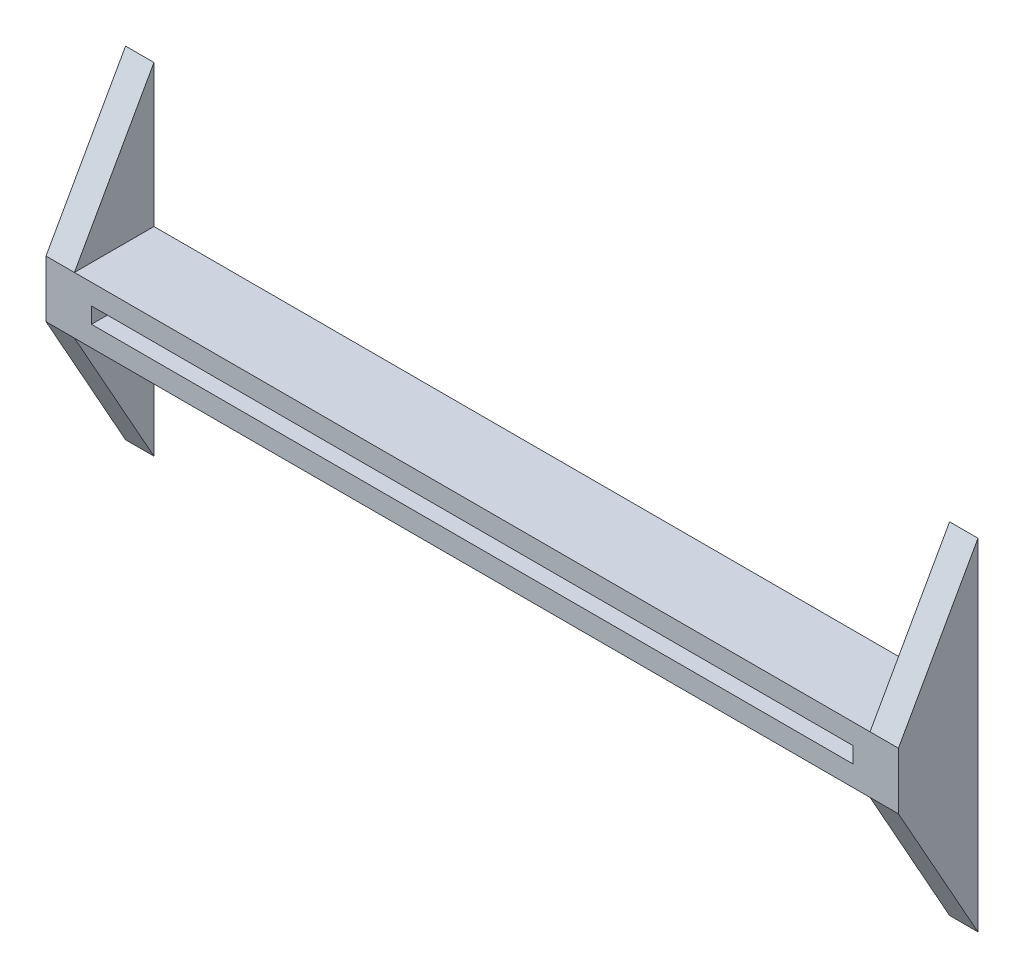
ISO-10303-21;
HEADER;
FILE_DESCRIPTION(('STEP AP214'),'2;1');
FILE_NAME('part.step','',(''),(''),'','','');
FILE_SCHEMA(('AUTOMOTIVE_DESIGN { 1 0 10303 214 1 1 1 1 }'));
ENDSEC;
DATA;
#1=APPLICATION_CONTEXT('core data for automotive mechanical design processes');
#2=APPLICATION_PROTOCOL_DEFINITION('international standard','automotive_design',2000,#1);
#3=PRODUCT_CONTEXT('',#1,'mechanical');
#4=PRODUCT('Part','Part','',(#3));
#5=PRODUCT_RELATED_PRODUCT_CATEGORY('part','',(#4));
#6=PRODUCT_DEFINITION_FORMATION('','',#4);
#7=PRODUCT_DEFINITION_CONTEXT('part definition',#1,'design');
#8=PRODUCT_DEFINITION('design','',#6,#7);
#9=PRODUCT_DEFINITION_SHAPE('','',#8);
#10=(LENGTH_UNIT() NAMED_UNIT(*) SI_UNIT(.MILLI.,.METRE.));
#11=(NAMED_UNIT(*) PLANE_ANGLE_UNIT() SI_UNIT($,.RADIAN.));
#12=(NAMED_UNIT(*) SI_UNIT($,.STERADIAN.) SOLID_ANGLE_UNIT());
#13=UNCERTAINTY_MEASURE_WITH_UNIT(LENGTH_MEASURE(1.E-05),#10,'distance_accuracy_value','');
#14=(GEOMETRIC_REPRESENTATION_CONTEXT(3) GLOBAL_UNCERTAINTY_ASSIGNED_CONTEXT((#13)) GLOBAL_UNIT_ASSIGNED_CONTEXT((#10,
#11,#12)) REPRESENTATION_CONTEXT('',''));
#15=CARTESIAN_POINT('',(0.,0.,0.));
#16=DIRECTION('',(0.,0.,1.));
#17=DIRECTION('',(1.,0.,0.));
#18=AXIS2_PLACEMENT_3D('',#15,#16,#17);
#19=CARTESIAN_POINT('',(0.,0.,5.));
#20=DIRECTION('',(0.,0.,-1.));
#21=DIRECTION('',(-1.,0.,0.));
#22=AXIS2_PLACEMENT_3D('',#19,#20,#21);
#23=PLANE('',#22);
#24=DIRECTION('',(-1.,0.,0.));
#25=VECTOR('',#24,1.);
#26=CARTESIAN_POINT('',(35.,2.5,5.));
#27=LINE('',#26,#25);
#28=CARTESIAN_POINT('',(35.,2.5,5.));
#29=VERTEX_POINT('',#28);
#30=CARTESIAN_POINT('',(-35.,2.5,5.));
#31=VERTEX_POINT('',#30);
#32=EDGE_CURVE('E170',#29,#31,#27,.T.);
#33=ORIENTED_EDGE('',*,*,#32,.T.);
#34=DIRECTION('',(1.,0.,0.));
#35=VECTOR('',#34,1.);
#36=CARTESIAN_POINT('',(-37.5,2.5,5.));
#37=LINE('',#36,#35);
#38=CARTESIAN_POINT('',(-37.5,2.5,5.));
#39=VERTEX_POINT('',#38);
#40=EDGE_CURVE('E147',#39,#31,#37,.T.);
#41=ORIENTED_EDGE('',*,*,#40,.F.);
#42=DIRECTION('',(0.,1.,0.));
#43=VECTOR('',#42,1.);
#44=CARTESIAN_POINT('',(-37.5,-2.5,5.));
#45=LINE('',#44,#43);
#46=CARTESIAN_POINT('',(-37.5,-2.5,5.));
#47=VERTEX_POINT('',#46);
#48=EDGE_CURVE('E155',#47,#39,#45,.T.);
#49=ORIENTED_EDGE('',*,*,#48,.F.);
#50=DIRECTION('',(1.,0.,0.));
#51=VECTOR('',#50,1.);
#52=CARTESIAN_POINT('',(-37.5,-2.5,5.));
#53=LINE('',#52,#51);
#54=CARTESIAN_POINT('',(-35.,-2.5,5.));
#55=VERTEX_POINT('',#54);
#56=EDGE_CURVE('E296',#47,#55,#53,.T.);
#57=ORIENTED_EDGE('',*,*,#56,.T.);
#58=DIRECTION('',(1.,0.,0.));
#59=VECTOR('',#58,1.);
#60=CARTESIAN_POINT('',(35.,-2.5,5.));
#61=LINE('',#60,#59);
#62=CARTESIAN_POINT('',(35.,-2.5,5.));
#63=VERTEX_POINT('',#62);
#64=EDGE_CURVE('E264',#55,#63,#61,.T.);
#65=ORIENTED_EDGE('',*,*,#64,.T.);
#66=DIRECTION('',(-1.,0.,0.));
#67=VECTOR('',#66,1.);
#68=CARTESIAN_POINT('',(37.5,-2.5,5.));
#69=LINE('',#68,#67);
#70=CARTESIAN_POINT('',(37.5,-2.5,5.));
#71=VERTEX_POINT('',#70);
#72=EDGE_CURVE('E215',#71,#63,#69,.T.);
#73=ORIENTED_EDGE('',*,*,#72,.F.);
#74=DIRECTION('',(0.,-1.,0.));
#75=VECTOR('',#74,1.);
#76=CARTESIAN_POINT('',(37.5,-2.5,5.));
#77=LINE('',#76,#75);
#78=CARTESIAN_POINT('',(37.5,2.5,5.));
#79=VERTEX_POINT('',#78);
#80=EDGE_CURVE('E183',#79,#71,#77,.T.);
#81=ORIENTED_EDGE('',*,*,#80,.F.);
#82=DIRECTION('',(-1.,0.,0.));
#83=VECTOR('',#82,1.);
#84=CARTESIAN_POINT('',(37.5,2.5,5.));
#85=LINE('',#84,#83);
#86=EDGE_CURVE('E196',#79,#29,#85,.T.);
#87=ORIENTED_EDGE('',*,*,#86,.T.);
#88=EDGE_LOOP('',(#33,#41,#49,#57,#65,#73,#81,#87));
#89=FACE_BOUND('',#88,.T.);
#90=DIRECTION('',(0.,-1.,0.));
#91=VECTOR('',#90,1.);
#92=CARTESIAN_POINT('',(-33.5,0.7,5.));
#93=LINE('',#92,#91);
#94=CARTESIAN_POINT('',(-33.5,0.7,5.));
#95=VERTEX_POINT('',#94);
#96=CARTESIAN_POINT('',(-33.5,-0.7,5.));
#97=VERTEX_POINT('',#96);
#98=EDGE_CURVE('E227',#95,#97,#93,.T.);
#99=ORIENTED_EDGE('',*,*,#98,.F.);
#100=DIRECTION('',(-1.,0.,0.));
#101=VECTOR('',#100,1.);
#102=CARTESIAN_POINT('',(33.5,0.700000000000008,5.));
#103=LINE('',#102,#101);
#104=CARTESIAN_POINT('',(33.5,0.700000000000008,5.));
#105=VERTEX_POINT('',#104);
#106=EDGE_CURVE('E237',#105,#95,#103,.T.);
#107=ORIENTED_EDGE('',*,*,#106,.F.);
#108=DIRECTION('',(0.,1.,0.));
#109=VECTOR('',#108,1.);
#110=CARTESIAN_POINT('',(33.5,0.700000000000008,5.));
#111=LINE('',#110,#109);
#112=CARTESIAN_POINT('',(33.5,-0.699999999999992,5.));
#113=VERTEX_POINT('',#112);
#114=EDGE_CURVE('E234',#113,#105,#111,.T.);
#115=ORIENTED_EDGE('',*,*,#114,.F.);
#116=DIRECTION('',(1.,0.,0.));
#117=VECTOR('',#116,1.);
#118=CARTESIAN_POINT('',(33.5,-0.699999999999992,5.));
#119=LINE('',#118,#117);
#120=EDGE_CURVE('E230',#97,#113,#119,.T.);
#121=ORIENTED_EDGE('',*,*,#120,.F.);
#122=EDGE_LOOP('',(#99,#107,#115,#121));
#123=FACE_BOUND('',#122,.T.);
#124=ADVANCED_FACE('F39',(#89,#123),#23,.F.);
#125=CARTESIAN_POINT('',(35.,-2.5,5.));
#126=DIRECTION('',(0.,1.,0.));
#127=DIRECTION('',(-1.,0.,0.));
#128=AXIS2_PLACEMENT_3D('',#125,#126,#127);
#129=PLANE('',#128);
#130=DIRECTION('',(0.,0.,-1.));
#131=VECTOR('',#130,1.);
#132=CARTESIAN_POINT('',(-35.,-2.5,5.));
#133=LINE('',#132,#131);
#134=CARTESIAN_POINT('',(-35.,-2.5,-2.));
#135=VERTEX_POINT('',#134);
#136=EDGE_CURVE('E11',#55,#135,#133,.T.);
#137=ORIENTED_EDGE('',*,*,#136,.T.);
#138=DIRECTION('',(-1.,0.,0.));
#139=VECTOR('',#138,1.);
#140=CARTESIAN_POINT('',(35.,-2.5,-2.));
#141=LINE('',#140,#139);
#142=CARTESIAN_POINT('',(35.,-2.5,-2.));
#143=VERTEX_POINT('',#142);
#144=EDGE_CURVE('E219',#143,#135,#141,.T.);
#145=ORIENTED_EDGE('',*,*,#144,.F.);
#146=DIRECTION('',(0.,0.,-1.));
#147=VECTOR('',#146,1.);
#148=CARTESIAN_POINT('',(35.,-2.5,5.));
#149=LINE('',#148,#147);
#150=EDGE_CURVE('E48',#63,#143,#149,.T.);
#151=ORIENTED_EDGE('',*,*,#150,.F.);
#152=ORIENTED_EDGE('',*,*,#64,.F.);
#153=EDGE_LOOP('',(#137,#145,#151,#152));
#154=FACE_BOUND('',#153,.T.);
#155=ADVANCED_FACE('F41',(#154),#129,.F.);
#156=CARTESIAN_POINT('',(35.,2.5,5.));
#157=DIRECTION('',(0.,-1.,0.));
#158=DIRECTION('',(1.,0.,0.));
#159=AXIS2_PLACEMENT_3D('',#156,#157,#158);
#160=PLANE('',#159);
#161=DIRECTION('',(0.,0.,-1.));
#162=VECTOR('',#161,1.);
#163=CARTESIAN_POINT('',(35.,2.5,5.));
#164=LINE('',#163,#162);
#165=CARTESIAN_POINT('',(35.,2.5,-2.));
#166=VERTEX_POINT('',#165);
#167=EDGE_CURVE('E273',#29,#166,#164,.T.);
#168=ORIENTED_EDGE('',*,*,#167,.T.);
#169=DIRECTION('',(-1.,0.,0.));
#170=VECTOR('',#169,1.);
#171=CARTESIAN_POINT('',(35.,2.5,-2.));
#172=LINE('',#171,#170);
#173=CARTESIAN_POINT('',(-35.,2.5,-2.));
#174=VERTEX_POINT('',#173);
#175=EDGE_CURVE('E223',#166,#174,#172,.T.);
#176=ORIENTED_EDGE('',*,*,#175,.T.);
#177=DIRECTION('',(0.,0.,-1.));
#178=VECTOR('',#177,1.);
#179=CARTESIAN_POINT('',(-35.,2.5,5.));
#180=LINE('',#179,#178);
#181=EDGE_CURVE('E270',#31,#174,#180,.T.);
#182=ORIENTED_EDGE('',*,*,#181,.F.);
#183=ORIENTED_EDGE('',*,*,#32,.F.);
#184=EDGE_LOOP('',(#168,#176,#182,#183));
#185=FACE_BOUND('',#184,.T.);
#186=ADVANCED_FACE('F321',(#185),#160,.F.);
#187=CARTESIAN_POINT('',(-33.5,0.7,5.));
#188=DIRECTION('',(1.,0.,0.));
#189=DIRECTION('',(0.,0.,-1.));
#190=AXIS2_PLACEMENT_3D('',#187,#188,#189);
#191=PLANE('',#190);
#192=DIRECTION('',(0.,-1.,0.));
#193=VECTOR('',#192,1.);
#194=CARTESIAN_POINT('',(-33.5,0.7,0.));
#195=LINE('',#194,#193);
#196=CARTESIAN_POINT('',(-33.5,0.7,0.));
#197=VERTEX_POINT('',#196);
#198=CARTESIAN_POINT('',(-33.5,-0.7,0.));
#199=VERTEX_POINT('',#198);
#200=EDGE_CURVE('E63',#197,#199,#195,.T.);
#201=ORIENTED_EDGE('',*,*,#200,.F.);
#202=DIRECTION('',(0.,0.,-1.));
#203=VECTOR('',#202,1.);
#204=CARTESIAN_POINT('',(-33.5,0.7,5.));
#205=LINE('',#204,#203);
#206=EDGE_CURVE('E240',#95,#197,#205,.T.);
#207=ORIENTED_EDGE('',*,*,#206,.F.);
#208=ORIENTED_EDGE('',*,*,#98,.T.);
#209=DIRECTION('',(0.,0.,-1.));
#210=VECTOR('',#209,1.);
#211=CARTESIAN_POINT('',(-33.5,-0.7,5.));
#212=LINE('',#211,#210);
#213=EDGE_CURVE('E261',#97,#199,#212,.T.);
#214=ORIENTED_EDGE('',*,*,#213,.T.);
#215=EDGE_LOOP('',(#201,#207,#208,#214));
#216=FACE_BOUND('',#215,.T.);
#217=ADVANCED_FACE('F352',(#216),#191,.T.);
#218=CARTESIAN_POINT('',(33.5,-0.699999999999992,5.));
#219=DIRECTION('',(0.,1.,0.));
#220=DIRECTION('',(-1.,0.,0.));
#221=AXIS2_PLACEMENT_3D('',#218,#219,#220);
#222=PLANE('',#221);
#223=DIRECTION('',(1.,0.,0.));
#224=VECTOR('',#223,1.);
#225=CARTESIAN_POINT('',(33.5,-0.699999999999992,0.));
#226=LINE('',#225,#224);
#227=CARTESIAN_POINT('',(33.5,-0.699999999999992,0.));
#228=VERTEX_POINT('',#227);
#229=EDGE_CURVE('E243',#199,#228,#226,.T.);
#230=ORIENTED_EDGE('',*,*,#229,.F.);
#231=ORIENTED_EDGE('',*,*,#213,.F.);
#232=ORIENTED_EDGE('',*,*,#120,.T.);
#233=DIRECTION('',(0.,0.,-1.));
#234=VECTOR('',#233,1.);
#235=CARTESIAN_POINT('',(33.5,-0.699999999999992,5.));
#236=LINE('',#235,#234);
#237=EDGE_CURVE('E258',#113,#228,#236,.T.);
#238=ORIENTED_EDGE('',*,*,#237,.T.);
#239=EDGE_LOOP('',(#230,#231,#232,#238));
#240=FACE_BOUND('',#239,.T.);
#241=ADVANCED_FACE('F358',(#240),#222,.T.);
#242=CARTESIAN_POINT('',(33.5,0.700000000000008,5.));
#243=DIRECTION('',(-1.,0.,0.));
#244=DIRECTION('',(0.,0.,1.));
#245=AXIS2_PLACEMENT_3D('',#242,#243,#244);
#246=PLANE('',#245);
#247=DIRECTION('',(0.,1.,0.));
#248=VECTOR('',#247,1.);
#249=CARTESIAN_POINT('',(33.5,0.700000000000008,0.));
#250=LINE('',#249,#248);
#251=CARTESIAN_POINT('',(33.5,0.700000000000008,0.));
#252=VERTEX_POINT('',#251);
#253=EDGE_CURVE('E247',#228,#252,#250,.T.);
#254=ORIENTED_EDGE('',*,*,#253,.F.);
#255=ORIENTED_EDGE('',*,*,#237,.F.);
#256=ORIENTED_EDGE('',*,*,#114,.T.);
#257=DIRECTION('',(0.,0.,-1.));
#258=VECTOR('',#257,1.);
#259=CARTESIAN_POINT('',(33.5,0.700000000000008,5.));
#260=LINE('',#259,#258);
#261=EDGE_CURVE('E55',#105,#252,#260,.T.);
#262=ORIENTED_EDGE('',*,*,#261,.T.);
#263=EDGE_LOOP('',(#254,#255,#256,#262));
#264=FACE_BOUND('',#263,.T.);
#265=ADVANCED_FACE('F362',(#264),#246,.T.);
#266=CARTESIAN_POINT('',(33.5,0.700000000000008,5.));
#267=DIRECTION('',(0.,-1.,0.));
#268=DIRECTION('',(1.,0.,0.));
#269=AXIS2_PLACEMENT_3D('',#266,#267,#268);
#270=PLANE('',#269);
#271=DIRECTION('',(-1.,0.,0.));
#272=VECTOR('',#271,1.);
#273=CARTESIAN_POINT('',(33.5,0.700000000000008,0.));
#274=LINE('',#273,#272);
#275=EDGE_CURVE('E231',#252,#197,#274,.T.);
#276=ORIENTED_EDGE('',*,*,#275,.F.);
#277=ORIENTED_EDGE('',*,*,#261,.F.);
#278=ORIENTED_EDGE('',*,*,#106,.T.);
#279=ORIENTED_EDGE('',*,*,#206,.T.);
#280=EDGE_LOOP('',(#276,#277,#278,#279));
#281=FACE_BOUND('',#280,.T.);
#282=ADVANCED_FACE('F367',(#281),#270,.T.);
#283=CARTESIAN_POINT('',(0.,0.,0.));
#284=DIRECTION('',(0.,0.,1.));
#285=DIRECTION('',(1.,0.,0.));
#286=AXIS2_PLACEMENT_3D('',#283,#284,#285);
#287=PLANE('',#286);
#288=ORIENTED_EDGE('',*,*,#253,.T.);
#289=ORIENTED_EDGE('',*,*,#275,.T.);
#290=ORIENTED_EDGE('',*,*,#200,.T.);
#291=ORIENTED_EDGE('',*,*,#229,.T.);
#292=EDGE_LOOP('',(#288,#289,#290,#291));
#293=FACE_BOUND('',#292,.T.);
#294=ADVANCED_FACE('F340',(#293),#287,.T.);
#295=CARTESIAN_POINT('',(0.,0.,-2.));
#296=DIRECTION('',(0.,0.,1.));
#297=DIRECTION('',(1.,0.,0.));
#298=AXIS2_PLACEMENT_3D('',#295,#296,#297);
#299=PLANE('',#298);
#300=ORIENTED_EDGE('',*,*,#144,.T.);
#301=DIRECTION('',(0.,-1.,0.));
#302=VECTOR('',#301,1.);
#303=CARTESIAN_POINT('',(-35.,15.,-2.00000000000001));
#304=LINE('',#303,#302);
#305=CARTESIAN_POINT('',(-35.,-15.,-2.));
#306=VERTEX_POINT('',#305);
#307=EDGE_CURVE('E292',#135,#306,#304,.T.);
#308=ORIENTED_EDGE('',*,*,#307,.T.);
#309=DIRECTION('',(1.,0.,0.));
#310=VECTOR('',#309,1.);
#311=CARTESIAN_POINT('',(-37.5,-15.,-2.));
#312=LINE('',#311,#310);
#313=CARTESIAN_POINT('',(-37.5,-15.,-2.));
#314=VERTEX_POINT('',#313);
#315=EDGE_CURVE('E179',#314,#306,#312,.T.);
#316=ORIENTED_EDGE('',*,*,#315,.F.);
#317=DIRECTION('',(0.,-1.,0.));
#318=VECTOR('',#317,1.);
#319=CARTESIAN_POINT('',(-37.5,15.,-2.00000000000001));
#320=LINE('',#319,#318);
#321=CARTESIAN_POINT('',(-37.5,15.,-2.00000000000001));
#322=VERTEX_POINT('',#321);
#323=EDGE_CURVE('E154',#322,#314,#320,.T.);
#324=ORIENTED_EDGE('',*,*,#323,.F.);
#325=DIRECTION('',(1.,0.,0.));
#326=VECTOR('',#325,1.);
#327=CARTESIAN_POINT('',(-37.5,15.,-2.00000000000001));
#328=LINE('',#327,#326);
#329=CARTESIAN_POINT('',(-35.,15.,-2.00000000000001));
#330=VERTEX_POINT('',#329);
#331=EDGE_CURVE('E150',#322,#330,#328,.T.);
#332=ORIENTED_EDGE('',*,*,#331,.T.);
#333=EDGE_CURVE('E299',#330,#174,#304,.T.);
#334=ORIENTED_EDGE('',*,*,#333,.T.);
#335=ORIENTED_EDGE('',*,*,#175,.F.);
#336=DIRECTION('',(0.,1.,0.));
#337=VECTOR('',#336,1.);
#338=CARTESIAN_POINT('',(35.,15.,-1.99999999999999));
#339=LINE('',#338,#337);
#340=CARTESIAN_POINT('',(35.,15.,-1.99999999999999));
#341=VERTEX_POINT('',#340);
#342=EDGE_CURVE('E177',#166,#341,#339,.T.);
#343=ORIENTED_EDGE('',*,*,#342,.T.);
#344=DIRECTION('',(-1.,0.,0.));
#345=VECTOR('',#344,1.);
#346=CARTESIAN_POINT('',(37.5,15.,-1.99999999999999));
#347=LINE('',#346,#345);
#348=CARTESIAN_POINT('',(37.5,15.,-1.99999999999999));
#349=VERTEX_POINT('',#348);
#350=EDGE_CURVE('E207',#349,#341,#347,.T.);
#351=ORIENTED_EDGE('',*,*,#350,.F.);
#352=DIRECTION('',(0.,1.,0.));
#353=VECTOR('',#352,1.);
#354=CARTESIAN_POINT('',(37.5,15.,-1.99999999999999));
#355=LINE('',#354,#353);
#356=CARTESIAN_POINT('',(37.5,-15.,-2.));
#357=VERTEX_POINT('',#356);
#358=EDGE_CURVE('E191',#357,#349,#355,.T.);
#359=ORIENTED_EDGE('',*,*,#358,.F.);
#360=DIRECTION('',(-1.,0.,0.));
#361=VECTOR('',#360,1.);
#362=CARTESIAN_POINT('',(37.5,-15.,-2.));
#363=LINE('',#362,#361);
#364=CARTESIAN_POINT('',(35.,-15.,-2.));
#365=VERTEX_POINT('',#364);
#366=EDGE_CURVE('E211',#357,#365,#363,.T.);
#367=ORIENTED_EDGE('',*,*,#366,.T.);
#368=EDGE_CURVE('E198',#365,#143,#339,.T.);
#369=ORIENTED_EDGE('',*,*,#368,.T.);
#370=EDGE_LOOP('',(#300,#308,#316,#324,#332,#334,#335,#343,#351,#359,#367,#369));
#371=FACE_BOUND('',#370,.T.);
#372=ADVANCED_FACE('F285',(#371),#299,.F.);
#373=CARTESIAN_POINT('',(35.,0.,0.));
#374=DIRECTION('',(-1.,0.,0.));
#375=DIRECTION('',(0.,0.,1.));
#376=AXIS2_PLACEMENT_3D('',#373,#374,#375);
#377=PLANE('',#376);
#378=ORIENTED_EDGE('',*,*,#167,.F.);
#379=DIRECTION('',(0.,-0.87250601594972,0.488603368931843));
#380=VECTOR('',#379,1.);
#381=CARTESIAN_POINT('',(35.,2.5,5.));
#382=LINE('',#381,#380);
#383=EDGE_CURVE('E188',#341,#29,#382,.T.);
#384=ORIENTED_EDGE('',*,*,#383,.F.);
#385=ORIENTED_EDGE('',*,*,#342,.F.);
#386=EDGE_LOOP('',(#378,#384,#385));
#387=FACE_BOUND('',#386,.T.);
#388=ADVANCED_FACE('F330',(#387),#377,.T.);
#389=CARTESIAN_POINT('',(37.5,-15.,-2.));
#390=DIRECTION('',(0.,0.488603368931843,-0.87250601594972));
#391=DIRECTION('',(0.,0.87250601594972,0.488603368931843));
#392=AXIS2_PLACEMENT_3D('',#389,#390,#391);
#393=PLANE('',#392);
#394=DIRECTION('',(0.,-0.87250601594972,-0.488603368931843));
#395=VECTOR('',#394,1.);
#396=CARTESIAN_POINT('',(35.,-15.,-2.));
#397=LINE('',#396,#395);
#398=EDGE_CURVE('E173',#63,#365,#397,.T.);
#399=ORIENTED_EDGE('',*,*,#398,.T.);
#400=ORIENTED_EDGE('',*,*,#366,.F.);
#401=DIRECTION('',(0.,-0.87250601594972,-0.488603368931843));
#402=VECTOR('',#401,1.);
#403=CARTESIAN_POINT('',(37.5,-15.,-2.));
#404=LINE('',#403,#402);
#405=EDGE_CURVE('E187',#71,#357,#404,.T.);
#406=ORIENTED_EDGE('',*,*,#405,.F.);
#407=ORIENTED_EDGE('',*,*,#72,.T.);
#408=EDGE_LOOP('',(#399,#400,#406,#407));
#409=FACE_BOUND('',#408,.T.);
#410=ADVANCED_FACE('F332',(#409),#393,.F.);
#411=CARTESIAN_POINT('',(37.5,2.5,5.));
#412=DIRECTION('',(0.,-0.488603368931843,-0.87250601594972));
#413=DIRECTION('',(0.,0.87250601594972,-0.488603368931843));
#414=AXIS2_PLACEMENT_3D('',#411,#412,#413);
#415=PLANE('',#414);
#416=ORIENTED_EDGE('',*,*,#383,.T.);
#417=ORIENTED_EDGE('',*,*,#86,.F.);
#418=DIRECTION('',(0.,-0.87250601594972,0.488603368931843));
#419=VECTOR('',#418,1.);
#420=CARTESIAN_POINT('',(37.5,2.5,5.));
#421=LINE('',#420,#419);
#422=EDGE_CURVE('E194',#349,#79,#421,.T.);
#423=ORIENTED_EDGE('',*,*,#422,.F.);
#424=ORIENTED_EDGE('',*,*,#350,.T.);
#425=EDGE_LOOP('',(#416,#417,#423,#424));
#426=FACE_BOUND('',#425,.T.);
#427=ADVANCED_FACE('F328',(#426),#415,.F.);
#428=CARTESIAN_POINT('',(37.5,0.,0.));
#429=DIRECTION('',(-1.,0.,0.));
#430=DIRECTION('',(0.,0.,1.));
#431=AXIS2_PLACEMENT_3D('',#428,#429,#430);
#432=PLANE('',#431);
#433=ORIENTED_EDGE('',*,*,#80,.T.);
#434=ORIENTED_EDGE('',*,*,#405,.T.);
#435=ORIENTED_EDGE('',*,*,#358,.T.);
#436=ORIENTED_EDGE('',*,*,#422,.T.);
#437=EDGE_LOOP('',(#433,#434,#435,#436));
#438=FACE_BOUND('',#437,.T.);
#439=ADVANCED_FACE('F345',(#438),#432,.F.);
#440=ORIENTED_EDGE('',*,*,#398,.F.);
#441=ORIENTED_EDGE('',*,*,#150,.T.);
#442=ORIENTED_EDGE('',*,*,#368,.F.);
#443=EDGE_LOOP('',(#440,#441,#442));
#444=FACE_BOUND('',#443,.T.);
#445=ADVANCED_FACE('F280',(#444),#377,.T.);
#446=CARTESIAN_POINT('',(-35.,0.,0.));
#447=DIRECTION('',(-1.,0.,0.));
#448=DIRECTION('',(0.,0.,1.));
#449=AXIS2_PLACEMENT_3D('',#446,#447,#448);
#450=PLANE('',#449);
#451=DIRECTION('',(0.,0.87250601594972,-0.488603368931844));
#452=VECTOR('',#451,1.);
#453=CARTESIAN_POINT('',(-35.,2.5,5.));
#454=LINE('',#453,#452);
#455=EDGE_CURVE('E311',#31,#330,#454,.T.);
#456=ORIENTED_EDGE('',*,*,#455,.F.);
#457=ORIENTED_EDGE('',*,*,#181,.T.);
#458=ORIENTED_EDGE('',*,*,#333,.F.);
#459=EDGE_LOOP('',(#456,#457,#458));
#460=FACE_BOUND('',#459,.T.);
#461=ADVANCED_FACE('F319',(#460),#450,.F.);
#462=CARTESIAN_POINT('',(-37.5,2.5,5.));
#463=DIRECTION('',(0.,-0.488603368931844,-0.87250601594972));
#464=DIRECTION('',(0.,0.87250601594972,-0.488603368931844));
#465=AXIS2_PLACEMENT_3D('',#462,#463,#464);
#466=PLANE('',#465);
#467=ORIENTED_EDGE('',*,*,#455,.T.);
#468=ORIENTED_EDGE('',*,*,#331,.F.);
#469=DIRECTION('',(0.,0.87250601594972,-0.488603368931844));
#470=VECTOR('',#469,1.);
#471=CARTESIAN_POINT('',(-37.5,2.5,5.));
#472=LINE('',#471,#470);
#473=EDGE_CURVE('E143',#39,#322,#472,.T.);
#474=ORIENTED_EDGE('',*,*,#473,.F.);
#475=ORIENTED_EDGE('',*,*,#40,.T.);
#476=EDGE_LOOP('',(#467,#468,#474,#475));
#477=FACE_BOUND('',#476,.T.);
#478=ADVANCED_FACE('F145',(#477),#466,.F.);
#479=CARTESIAN_POINT('',(-37.5,-15.,-2.));
#480=DIRECTION('',(0.,0.488603368931843,-0.87250601594972));
#481=DIRECTION('',(0.,0.87250601594972,0.488603368931843));
#482=AXIS2_PLACEMENT_3D('',#479,#480,#481);
#483=PLANE('',#482);
#484=DIRECTION('',(0.,0.87250601594972,0.488603368931843));
#485=VECTOR('',#484,1.);
#486=CARTESIAN_POINT('',(-35.,-15.,-2.));
#487=LINE('',#486,#485);
#488=EDGE_CURVE('E165',#306,#55,#487,.T.);
#489=ORIENTED_EDGE('',*,*,#488,.T.);
#490=ORIENTED_EDGE('',*,*,#56,.F.);
#491=DIRECTION('',(0.,0.87250601594972,0.488603368931843));
#492=VECTOR('',#491,1.);
#493=CARTESIAN_POINT('',(-37.5,-15.,-2.));
#494=LINE('',#493,#492);
#495=EDGE_CURVE('E160',#314,#47,#494,.T.);
#496=ORIENTED_EDGE('',*,*,#495,.F.);
#497=ORIENTED_EDGE('',*,*,#315,.T.);
#498=EDGE_LOOP('',(#489,#490,#496,#497));
#499=FACE_BOUND('',#498,.T.);
#500=ADVANCED_FACE('F295',(#499),#483,.F.);
#501=CARTESIAN_POINT('',(-37.5,0.,0.));
#502=DIRECTION('',(-1.,0.,0.));
#503=DIRECTION('',(0.,0.,1.));
#504=AXIS2_PLACEMENT_3D('',#501,#502,#503);
#505=PLANE('',#504);
#506=ORIENTED_EDGE('',*,*,#48,.T.);
#507=ORIENTED_EDGE('',*,*,#473,.T.);
#508=ORIENTED_EDGE('',*,*,#323,.T.);
#509=ORIENTED_EDGE('',*,*,#495,.T.);
#510=EDGE_LOOP('',(#506,#507,#508,#509));
#511=FACE_BOUND('',#510,.T.);
#512=ADVANCED_FACE('F158',(#511),#505,.T.);
#513=ORIENTED_EDGE('',*,*,#136,.F.);
#514=ORIENTED_EDGE('',*,*,#488,.F.);
#515=ORIENTED_EDGE('',*,*,#307,.F.);
#516=EDGE_LOOP('',(#513,#514,#515));
#517=FACE_BOUND('',#516,.T.);
#518=ADVANCED_FACE('F291',(#517),#450,.F.);
#519=CLOSED_SHELL('',(#124,#155,#186,#217,#241,#265,#282,#294,#372,#388,#410,#427,#439,#445,
#461,#478,#500,#512,#518));
#520=MANIFOLD_SOLID_BREP('B2',#519);
#521=ADVANCED_BREP_SHAPE_REPRESENTATION('',(#18,#520),#14);
#522=SHAPE_DEFINITION_REPRESENTATION(#9,#521);
ENDSEC;
END-ISO-10303-21;
